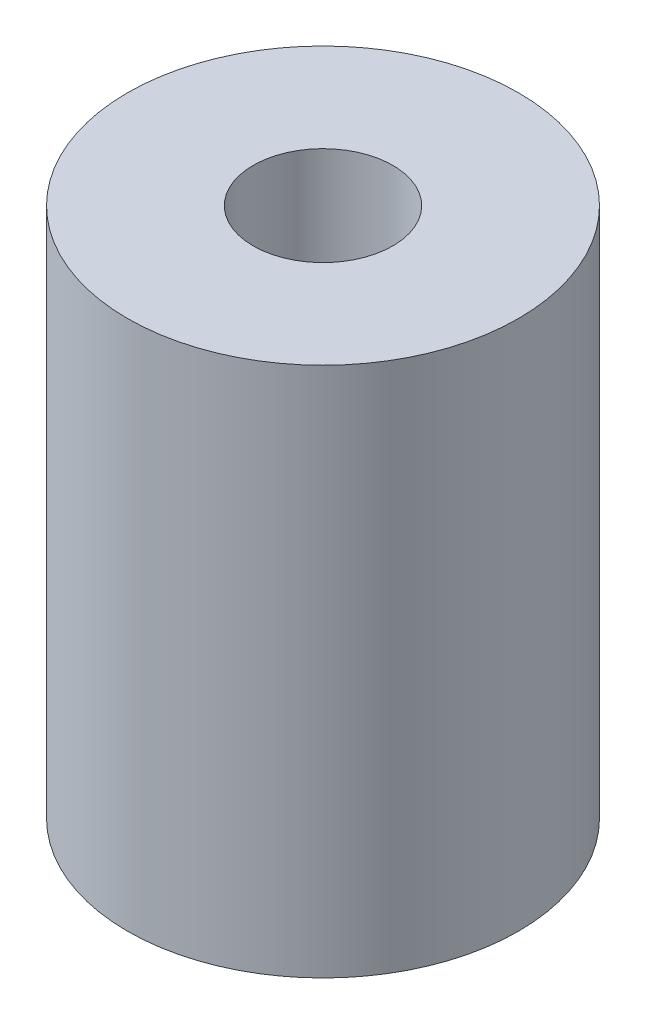
ISO-10303-21;
HEADER;
FILE_DESCRIPTION(('STEP AP214'),'2;1');
FILE_NAME('part.step','',(''),(''),'','','');
FILE_SCHEMA(('AUTOMOTIVE_DESIGN { 1 0 10303 214 1 1 1 1 }'));
ENDSEC;
DATA;
#1=APPLICATION_CONTEXT('core data for automotive mechanical design processes');
#2=APPLICATION_PROTOCOL_DEFINITION('international standard','automotive_design',2000,#1);
#3=PRODUCT_CONTEXT('',#1,'mechanical');
#4=PRODUCT('Part','Part','',(#3));
#5=PRODUCT_RELATED_PRODUCT_CATEGORY('part','',(#4));
#6=PRODUCT_DEFINITION_FORMATION('','',#4);
#7=PRODUCT_DEFINITION_CONTEXT('part definition',#1,'design');
#8=PRODUCT_DEFINITION('design','',#6,#7);
#9=PRODUCT_DEFINITION_SHAPE('','',#8);
#10=(LENGTH_UNIT() NAMED_UNIT(*) SI_UNIT(.MILLI.,.METRE.));
#11=(NAMED_UNIT(*) PLANE_ANGLE_UNIT() SI_UNIT($,.RADIAN.));
#12=(NAMED_UNIT(*) SI_UNIT($,.STERADIAN.) SOLID_ANGLE_UNIT());
#13=UNCERTAINTY_MEASURE_WITH_UNIT(LENGTH_MEASURE(1.E-05),#10,'distance_accuracy_value','');
#14=(GEOMETRIC_REPRESENTATION_CONTEXT(3) GLOBAL_UNCERTAINTY_ASSIGNED_CONTEXT((#13)) GLOBAL_UNIT_ASSIGNED_CONTEXT((#10,
#11,#12)) REPRESENTATION_CONTEXT('',''));
#15=CARTESIAN_POINT('',(0.,0.,0.));
#16=DIRECTION('',(0.,0.,1.));
#17=DIRECTION('',(1.,0.,0.));
#18=AXIS2_PLACEMENT_3D('',#15,#16,#17);
#19=CARTESIAN_POINT('',(0.,19.,0.));
#20=DIRECTION('',(0.,1.,0.));
#21=DIRECTION('',(0.,0.,1.));
#22=AXIS2_PLACEMENT_3D('',#19,#20,#21);
#23=PLANE('',#22);
#24=CARTESIAN_POINT('',(0.,19.,0.));
#25=DIRECTION('',(0.,1.,0.));
#26=DIRECTION('',(0.,0.,1.));
#27=AXIS2_PLACEMENT_3D('',#24,#25,#26);
#28=CIRCLE('',#27,7.);
#29=CARTESIAN_POINT('',(0.,19.,7.));
#30=VERTEX_POINT('',#29);
#31=EDGE_CURVE('E10',#30,#30,#28,.T.);
#32=ORIENTED_EDGE('',*,*,#31,.T.);
#33=EDGE_LOOP('',(#32));
#34=FACE_BOUND('',#33,.T.);
#35=CARTESIAN_POINT('',(0.,19.,0.));
#36=DIRECTION('',(0.,1.,0.));
#37=DIRECTION('',(0.,0.,1.));
#38=AXIS2_PLACEMENT_3D('',#35,#36,#37);
#39=CIRCLE('',#38,2.5);
#40=CARTESIAN_POINT('',(0.,19.,2.5));
#41=VERTEX_POINT('',#40);
#42=EDGE_CURVE('E42',#41,#41,#39,.T.);
#43=ORIENTED_EDGE('',*,*,#42,.F.);
#44=EDGE_LOOP('',(#43));
#45=FACE_BOUND('',#44,.T.);
#46=ADVANCED_FACE('F31',(#34,#45),#23,.T.);
#47=CARTESIAN_POINT('',(0.,0.,0.));
#48=DIRECTION('',(0.,1.,0.));
#49=DIRECTION('',(0.,0.,1.));
#50=AXIS2_PLACEMENT_3D('',#47,#48,#49);
#51=PLANE('',#50);
#52=CARTESIAN_POINT('',(0.,0.,0.));
#53=DIRECTION('',(0.,1.,0.));
#54=DIRECTION('',(0.,0.,1.));
#55=AXIS2_PLACEMENT_3D('',#52,#53,#54);
#56=CIRCLE('',#55,7.);
#57=CARTESIAN_POINT('',(0.,0.,7.));
#58=VERTEX_POINT('',#57);
#59=EDGE_CURVE('E35',#58,#58,#56,.T.);
#60=ORIENTED_EDGE('',*,*,#59,.F.);
#61=EDGE_LOOP('',(#60));
#62=FACE_BOUND('',#61,.T.);
#63=CARTESIAN_POINT('',(0.,0.,0.));
#64=DIRECTION('',(0.,1.,0.));
#65=DIRECTION('',(0.,0.,1.));
#66=AXIS2_PLACEMENT_3D('',#63,#64,#65);
#67=CIRCLE('',#66,2.5);
#68=CARTESIAN_POINT('',(0.,0.,2.5));
#69=VERTEX_POINT('',#68);
#70=EDGE_CURVE('E44',#69,#69,#67,.T.);
#71=ORIENTED_EDGE('',*,*,#70,.T.);
#72=EDGE_LOOP('',(#71));
#73=FACE_BOUND('',#72,.T.);
#74=ADVANCED_FACE('F54',(#62,#73),#51,.F.);
#75=CARTESIAN_POINT('',(0.,19.,0.));
#76=DIRECTION('',(0.,-1.,0.));
#77=DIRECTION('',(0.,0.,-1.));
#78=AXIS2_PLACEMENT_3D('',#75,#76,#77);
#79=CYLINDRICAL_SURFACE('',#78,7.);
#80=ORIENTED_EDGE('',*,*,#31,.F.);
#81=EDGE_LOOP('',(#80));
#82=FACE_BOUND('',#81,.T.);
#83=ORIENTED_EDGE('',*,*,#59,.T.);
#84=EDGE_LOOP('',(#83));
#85=FACE_BOUND('',#84,.T.);
#86=ADVANCED_FACE('F33',(#82,#85),#79,.T.);
#87=CARTESIAN_POINT('',(0.,19.,0.));
#88=DIRECTION('',(0.,-1.,0.));
#89=DIRECTION('',(0.,0.,-1.));
#90=AXIS2_PLACEMENT_3D('',#87,#88,#89);
#91=CYLINDRICAL_SURFACE('',#90,2.5);
#92=ORIENTED_EDGE('',*,*,#42,.T.);
#93=EDGE_LOOP('',(#92));
#94=FACE_BOUND('',#93,.T.);
#95=ORIENTED_EDGE('',*,*,#70,.F.);
#96=EDGE_LOOP('',(#95));
#97=FACE_BOUND('',#96,.T.);
#98=ADVANCED_FACE('F50',(#94,#97),#91,.F.);
#99=CLOSED_SHELL('',(#46,#74,#86,#98));
#100=MANIFOLD_SOLID_BREP('B2',#99);
#101=ADVANCED_BREP_SHAPE_REPRESENTATION('',(#18,#100),#14);
#102=SHAPE_DEFINITION_REPRESENTATION(#9,#101);
ENDSEC;
END-ISO-10303-21;
